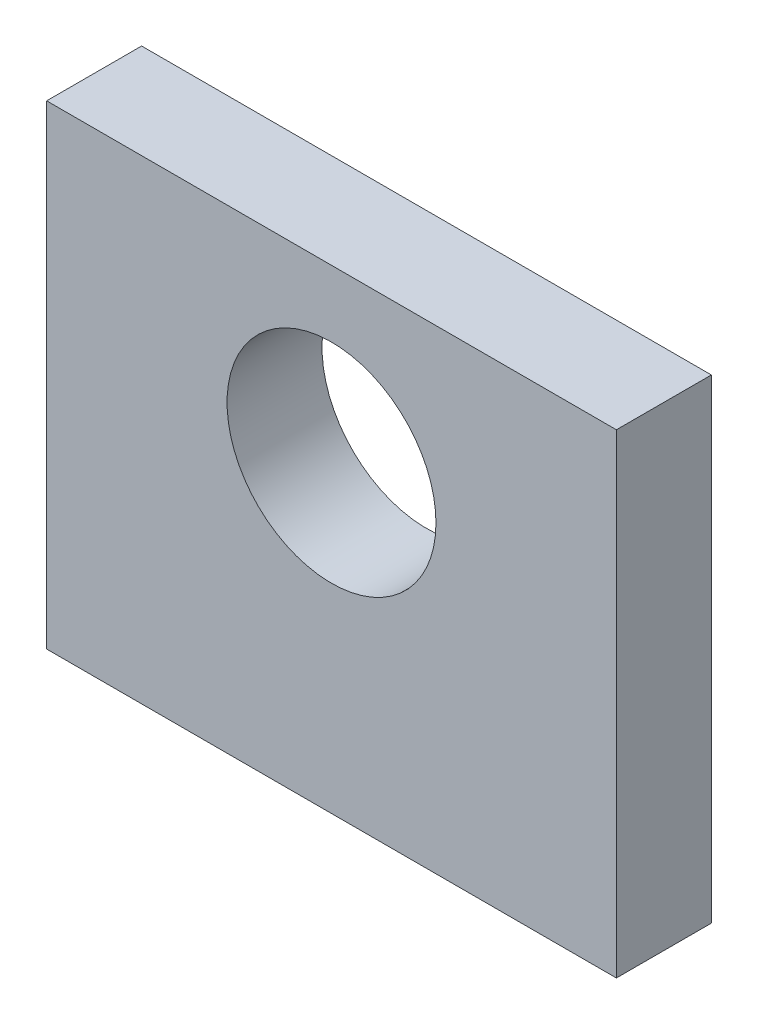
ISO-10303-21;
HEADER;
FILE_DESCRIPTION(('STEP AP214'),'2;1');
FILE_NAME('part.step','',(''),(''),'','','');
FILE_SCHEMA(('AUTOMOTIVE_DESIGN { 1 0 10303 214 1 1 1 1 }'));
ENDSEC;
DATA;
#1=APPLICATION_CONTEXT('core data for automotive mechanical design processes');
#2=APPLICATION_PROTOCOL_DEFINITION('international standard','automotive_design',2000,#1);
#3=PRODUCT_CONTEXT('',#1,'mechanical');
#4=PRODUCT('Part','Part','',(#3));
#5=PRODUCT_RELATED_PRODUCT_CATEGORY('part','',(#4));
#6=PRODUCT_DEFINITION_FORMATION('','',#4);
#7=PRODUCT_DEFINITION_CONTEXT('part definition',#1,'design');
#8=PRODUCT_DEFINITION('design','',#6,#7);
#9=PRODUCT_DEFINITION_SHAPE('','',#8);
#10=(LENGTH_UNIT() NAMED_UNIT(*) SI_UNIT(.MILLI.,.METRE.));
#11=(NAMED_UNIT(*) PLANE_ANGLE_UNIT() SI_UNIT($,.RADIAN.));
#12=(NAMED_UNIT(*) SI_UNIT($,.STERADIAN.) SOLID_ANGLE_UNIT());
#13=UNCERTAINTY_MEASURE_WITH_UNIT(LENGTH_MEASURE(1.E-05),#10,'distance_accuracy_value','');
#14=(GEOMETRIC_REPRESENTATION_CONTEXT(3) GLOBAL_UNCERTAINTY_ASSIGNED_CONTEXT((#13)) GLOBAL_UNIT_ASSIGNED_CONTEXT((#10,
#11,#12)) REPRESENTATION_CONTEXT('',''));
#15=CARTESIAN_POINT('',(0.,0.,0.));
#16=DIRECTION('',(0.,0.,1.));
#17=DIRECTION('',(1.,0.,0.));
#18=AXIS2_PLACEMENT_3D('',#15,#16,#17);
#19=CARTESIAN_POINT('',(0.,0.,10.));
#20=DIRECTION('',(0.,0.,-1.));
#21=DIRECTION('',(-1.,0.,0.));
#22=AXIS2_PLACEMENT_3D('',#19,#20,#21);
#23=PLANE('',#22);
#24=DIRECTION('',(0.,-1.,0.));
#25=VECTOR('',#24,1.);
#26=CARTESIAN_POINT('',(0.,0.,10.));
#27=LINE('',#26,#25);
#28=CARTESIAN_POINT('',(0.,50.,10.));
#29=VERTEX_POINT('',#28);
#30=CARTESIAN_POINT('',(0.,0.,10.));
#31=VERTEX_POINT('',#30);
#32=EDGE_CURVE('E103',#29,#31,#27,.T.);
#33=ORIENTED_EDGE('',*,*,#32,.T.);
#34=DIRECTION('',(1.,0.,0.));
#35=VECTOR('',#34,1.);
#36=CARTESIAN_POINT('',(0.,0.,10.));
#37=LINE('',#36,#35);
#38=CARTESIAN_POINT('',(60.,0.,10.));
#39=VERTEX_POINT('',#38);
#40=EDGE_CURVE('E98',#31,#39,#37,.T.);
#41=ORIENTED_EDGE('',*,*,#40,.T.);
#42=DIRECTION('',(0.,1.,0.));
#43=VECTOR('',#42,1.);
#44=CARTESIAN_POINT('',(60.,0.,10.));
#45=LINE('',#44,#43);
#46=CARTESIAN_POINT('',(60.,50.,10.));
#47=VERTEX_POINT('',#46);
#48=EDGE_CURVE('E101',#39,#47,#45,.T.);
#49=ORIENTED_EDGE('',*,*,#48,.T.);
#50=DIRECTION('',(-1.,0.,0.));
#51=VECTOR('',#50,1.);
#52=CARTESIAN_POINT('',(0.,50.,10.));
#53=LINE('',#52,#51);
#54=EDGE_CURVE('E68',#47,#29,#53,.T.);
#55=ORIENTED_EDGE('',*,*,#54,.T.);
#56=EDGE_LOOP('',(#33,#41,#49,#55));
#57=FACE_BOUND('',#56,.T.);
#58=CARTESIAN_POINT('',(30.,32.,10.));
#59=DIRECTION('',(0.,0.,1.));
#60=DIRECTION('',(1.,0.,0.));
#61=AXIS2_PLACEMENT_3D('',#58,#59,#60);
#62=CIRCLE('',#61,11.);
#63=CARTESIAN_POINT('',(41.,32.,10.));
#64=VERTEX_POINT('',#63);
#65=EDGE_CURVE('E118',#64,#64,#62,.T.);
#66=ORIENTED_EDGE('',*,*,#65,.F.);
#67=EDGE_LOOP('',(#66));
#68=FACE_BOUND('',#67,.T.);
#69=ADVANCED_FACE('F51',(#57,#68),#23,.F.);
#70=CARTESIAN_POINT('',(0.,0.,0.));
#71=DIRECTION('',(0.,0.,-1.));
#72=DIRECTION('',(-1.,0.,0.));
#73=AXIS2_PLACEMENT_3D('',#70,#71,#72);
#74=PLANE('',#73);
#75=DIRECTION('',(0.,-1.,0.));
#76=VECTOR('',#75,1.);
#77=CARTESIAN_POINT('',(0.,0.,0.));
#78=LINE('',#77,#76);
#79=CARTESIAN_POINT('',(0.,50.,0.));
#80=VERTEX_POINT('',#79);
#81=CARTESIAN_POINT('',(0.,0.,0.));
#82=VERTEX_POINT('',#81);
#83=EDGE_CURVE('E115',#80,#82,#78,.T.);
#84=ORIENTED_EDGE('',*,*,#83,.F.);
#85=DIRECTION('',(-1.,0.,0.));
#86=VECTOR('',#85,1.);
#87=CARTESIAN_POINT('',(0.,50.,0.));
#88=LINE('',#87,#86);
#89=CARTESIAN_POINT('',(60.,50.,0.));
#90=VERTEX_POINT('',#89);
#91=EDGE_CURVE('E91',#90,#80,#88,.T.);
#92=ORIENTED_EDGE('',*,*,#91,.F.);
#93=DIRECTION('',(0.,1.,0.));
#94=VECTOR('',#93,1.);
#95=CARTESIAN_POINT('',(60.,0.,0.));
#96=LINE('',#95,#94);
#97=CARTESIAN_POINT('',(60.,0.,0.));
#98=VERTEX_POINT('',#97);
#99=EDGE_CURVE('E85',#98,#90,#96,.T.);
#100=ORIENTED_EDGE('',*,*,#99,.F.);
#101=DIRECTION('',(1.,0.,0.));
#102=VECTOR('',#101,1.);
#103=CARTESIAN_POINT('',(0.,0.,0.));
#104=LINE('',#103,#102);
#105=EDGE_CURVE('E107',#82,#98,#104,.T.);
#106=ORIENTED_EDGE('',*,*,#105,.F.);
#107=EDGE_LOOP('',(#84,#92,#100,#106));
#108=FACE_BOUND('',#107,.T.);
#109=CARTESIAN_POINT('',(30.,32.,0.));
#110=DIRECTION('',(0.,0.,1.));
#111=DIRECTION('',(1.,0.,0.));
#112=AXIS2_PLACEMENT_3D('',#109,#110,#111);
#113=CIRCLE('',#112,11.);
#114=CARTESIAN_POINT('',(41.,32.,0.));
#115=VERTEX_POINT('',#114);
#116=EDGE_CURVE('E130',#115,#115,#113,.T.);
#117=ORIENTED_EDGE('',*,*,#116,.T.);
#118=EDGE_LOOP('',(#117));
#119=FACE_BOUND('',#118,.T.);
#120=ADVANCED_FACE('F126',(#108,#119),#74,.T.);
#121=CARTESIAN_POINT('',(0.,0.,10.));
#122=DIRECTION('',(1.,0.,0.));
#123=DIRECTION('',(0.,0.,-1.));
#124=AXIS2_PLACEMENT_3D('',#121,#122,#123);
#125=PLANE('',#124);
#126=ORIENTED_EDGE('',*,*,#83,.T.);
#127=DIRECTION('',(0.,0.,-1.));
#128=VECTOR('',#127,1.);
#129=CARTESIAN_POINT('',(0.,0.,10.));
#130=LINE('',#129,#128);
#131=EDGE_CURVE('E13',#31,#82,#130,.T.);
#132=ORIENTED_EDGE('',*,*,#131,.F.);
#133=ORIENTED_EDGE('',*,*,#32,.F.);
#134=DIRECTION('',(0.,0.,-1.));
#135=VECTOR('',#134,1.);
#136=CARTESIAN_POINT('',(0.,50.,10.));
#137=LINE('',#136,#135);
#138=EDGE_CURVE('E111',#29,#80,#137,.T.);
#139=ORIENTED_EDGE('',*,*,#138,.T.);
#140=EDGE_LOOP('',(#126,#132,#133,#139));
#141=FACE_BOUND('',#140,.T.);
#142=ADVANCED_FACE('F53',(#141),#125,.F.);
#143=CARTESIAN_POINT('',(0.,0.,10.));
#144=DIRECTION('',(0.,1.,0.));
#145=DIRECTION('',(0.,0.,1.));
#146=AXIS2_PLACEMENT_3D('',#143,#144,#145);
#147=PLANE('',#146);
#148=ORIENTED_EDGE('',*,*,#105,.T.);
#149=DIRECTION('',(0.,0.,-1.));
#150=VECTOR('',#149,1.);
#151=CARTESIAN_POINT('',(60.,0.,10.));
#152=LINE('',#151,#150);
#153=EDGE_CURVE('E60',#39,#98,#152,.T.);
#154=ORIENTED_EDGE('',*,*,#153,.F.);
#155=ORIENTED_EDGE('',*,*,#40,.F.);
#156=ORIENTED_EDGE('',*,*,#131,.T.);
#157=EDGE_LOOP('',(#148,#154,#155,#156));
#158=FACE_BOUND('',#157,.T.);
#159=ADVANCED_FACE('F106',(#158),#147,.F.);
#160=CARTESIAN_POINT('',(60.,0.,10.));
#161=DIRECTION('',(-1.,0.,0.));
#162=DIRECTION('',(0.,0.,1.));
#163=AXIS2_PLACEMENT_3D('',#160,#161,#162);
#164=PLANE('',#163);
#165=ORIENTED_EDGE('',*,*,#99,.T.);
#166=DIRECTION('',(0.,0.,-1.));
#167=VECTOR('',#166,1.);
#168=CARTESIAN_POINT('',(60.,50.,10.));
#169=LINE('',#168,#167);
#170=EDGE_CURVE('E108',#47,#90,#169,.T.);
#171=ORIENTED_EDGE('',*,*,#170,.F.);
#172=ORIENTED_EDGE('',*,*,#48,.F.);
#173=ORIENTED_EDGE('',*,*,#153,.T.);
#174=EDGE_LOOP('',(#165,#171,#172,#173));
#175=FACE_BOUND('',#174,.T.);
#176=ADVANCED_FACE('F109',(#175),#164,.F.);
#177=CARTESIAN_POINT('',(0.,50.,10.));
#178=DIRECTION('',(0.,-1.,0.));
#179=DIRECTION('',(0.,0.,-1.));
#180=AXIS2_PLACEMENT_3D('',#177,#178,#179);
#181=PLANE('',#180);
#182=ORIENTED_EDGE('',*,*,#91,.T.);
#183=ORIENTED_EDGE('',*,*,#138,.F.);
#184=ORIENTED_EDGE('',*,*,#54,.F.);
#185=ORIENTED_EDGE('',*,*,#170,.T.);
#186=EDGE_LOOP('',(#182,#183,#184,#185));
#187=FACE_BOUND('',#186,.T.);
#188=ADVANCED_FACE('F123',(#187),#181,.F.);
#189=CARTESIAN_POINT('',(30.,32.,10.));
#190=DIRECTION('',(0.,0.,-1.));
#191=DIRECTION('',(-1.,0.,0.));
#192=AXIS2_PLACEMENT_3D('',#189,#190,#191);
#193=CYLINDRICAL_SURFACE('',#192,11.);
#194=ORIENTED_EDGE('',*,*,#65,.T.);
#195=EDGE_LOOP('',(#194));
#196=FACE_BOUND('',#195,.T.);
#197=ORIENTED_EDGE('',*,*,#116,.F.);
#198=EDGE_LOOP('',(#197));
#199=FACE_BOUND('',#198,.T.);
#200=ADVANCED_FACE('F136',(#196,#199),#193,.F.);
#201=CLOSED_SHELL('',(#69,#120,#142,#159,#176,#188,#200));
#202=MANIFOLD_SOLID_BREP('B2',#201);
#203=ADVANCED_BREP_SHAPE_REPRESENTATION('',(#18,#202),#14);
#204=SHAPE_DEFINITION_REPRESENTATION(#9,#203);
ENDSEC;
END-ISO-10303-21;
